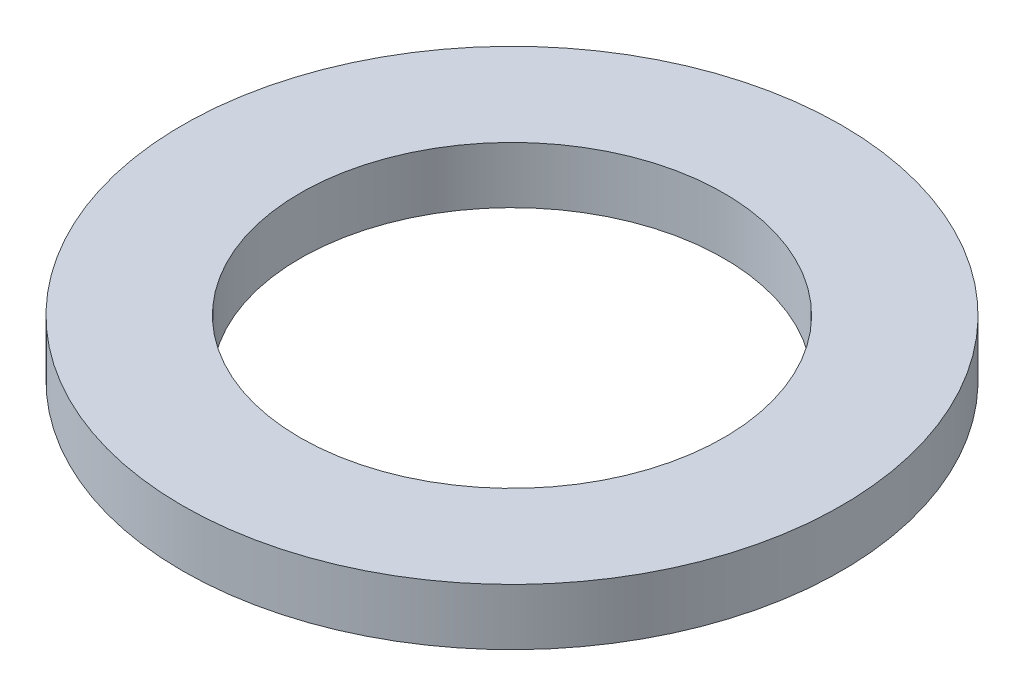
ISO-10303-21;
HEADER;
FILE_DESCRIPTION(('STEP AP214'),'2;1');
FILE_NAME('part.step','',(''),(''),'','','');
FILE_SCHEMA(('AUTOMOTIVE_DESIGN { 1 0 10303 214 1 1 1 1 }'));
ENDSEC;
DATA;
#1=APPLICATION_CONTEXT('core data for automotive mechanical design processes');
#2=APPLICATION_PROTOCOL_DEFINITION('international standard','automotive_design',2000,#1);
#3=PRODUCT_CONTEXT('',#1,'mechanical');
#4=PRODUCT('Part','Part','',(#3));
#5=PRODUCT_RELATED_PRODUCT_CATEGORY('part','',(#4));
#6=PRODUCT_DEFINITION_FORMATION('','',#4);
#7=PRODUCT_DEFINITION_CONTEXT('part definition',#1,'design');
#8=PRODUCT_DEFINITION('design','',#6,#7);
#9=PRODUCT_DEFINITION_SHAPE('','',#8);
#10=(LENGTH_UNIT() NAMED_UNIT(*) SI_UNIT(.MILLI.,.METRE.));
#11=(NAMED_UNIT(*) PLANE_ANGLE_UNIT() SI_UNIT($,.RADIAN.));
#12=(NAMED_UNIT(*) SI_UNIT($,.STERADIAN.) SOLID_ANGLE_UNIT());
#13=UNCERTAINTY_MEASURE_WITH_UNIT(LENGTH_MEASURE(1.E-05),#10,'distance_accuracy_value','');
#14=(GEOMETRIC_REPRESENTATION_CONTEXT(3) GLOBAL_UNCERTAINTY_ASSIGNED_CONTEXT((#13)) GLOBAL_UNIT_ASSIGNED_CONTEXT((#10,
#11,#12)) REPRESENTATION_CONTEXT('',''));
#15=CARTESIAN_POINT('',(0.,0.,0.));
#16=DIRECTION('',(0.,0.,1.));
#17=DIRECTION('',(1.,0.,0.));
#18=AXIS2_PLACEMENT_3D('',#15,#16,#17);
#19=CARTESIAN_POINT('',(0.,3.,0.));
#20=DIRECTION('',(0.,-1.,0.));
#21=DIRECTION('',(0.,0.,-1.));
#22=AXIS2_PLACEMENT_3D('',#19,#20,#21);
#23=CYLINDRICAL_SURFACE('',#22,17.5);
#24=CARTESIAN_POINT('',(0.,3.,0.));
#25=DIRECTION('',(0.,1.,0.));
#26=DIRECTION('',(0.,0.,1.));
#27=AXIS2_PLACEMENT_3D('',#24,#25,#26);
#28=CIRCLE('',#27,17.5);
#29=CARTESIAN_POINT('',(0.,3.,17.5));
#30=VERTEX_POINT('',#29);
#31=EDGE_CURVE('E10',#30,#30,#28,.T.);
#32=ORIENTED_EDGE('',*,*,#31,.F.);
#33=EDGE_LOOP('',(#32));
#34=FACE_BOUND('',#33,.T.);
#35=CARTESIAN_POINT('',(0.,0.,0.));
#36=DIRECTION('',(0.,1.,0.));
#37=DIRECTION('',(0.,0.,1.));
#38=AXIS2_PLACEMENT_3D('',#35,#36,#37);
#39=CIRCLE('',#38,17.5);
#40=CARTESIAN_POINT('',(0.,0.,17.5));
#41=VERTEX_POINT('',#40);
#42=EDGE_CURVE('E34',#41,#41,#39,.T.);
#43=ORIENTED_EDGE('',*,*,#42,.T.);
#44=EDGE_LOOP('',(#43));
#45=FACE_BOUND('',#44,.T.);
#46=ADVANCED_FACE('F31',(#34,#45),#23,.T.);
#47=CARTESIAN_POINT('',(0.,3.,0.));
#48=DIRECTION('',(0.,1.,0.));
#49=DIRECTION('',(0.,0.,1.));
#50=AXIS2_PLACEMENT_3D('',#47,#48,#49);
#51=PLANE('',#50);
#52=CARTESIAN_POINT('',(0.,3.,0.));
#53=DIRECTION('',(0.,1.,0.));
#54=DIRECTION('',(0.,0.,1.));
#55=AXIS2_PLACEMENT_3D('',#52,#53,#54);
#56=CIRCLE('',#55,11.25);
#57=CARTESIAN_POINT('',(0.,3.,11.25));
#58=VERTEX_POINT('',#57);
#59=EDGE_CURVE('E43',#58,#58,#56,.T.);
#60=ORIENTED_EDGE('',*,*,#59,.F.);
#61=EDGE_LOOP('',(#60));
#62=FACE_BOUND('',#61,.T.);
#63=ORIENTED_EDGE('',*,*,#31,.T.);
#64=EDGE_LOOP('',(#63));
#65=FACE_BOUND('',#64,.T.);
#66=ADVANCED_FACE('F58',(#62,#65),#51,.T.);
#67=CARTESIAN_POINT('',(0.,0.,0.));
#68=DIRECTION('',(0.,1.,0.));
#69=DIRECTION('',(0.,0.,1.));
#70=AXIS2_PLACEMENT_3D('',#67,#68,#69);
#71=PLANE('',#70);
#72=CARTESIAN_POINT('',(0.,0.,0.));
#73=DIRECTION('',(0.,1.,0.));
#74=DIRECTION('',(0.,0.,1.));
#75=AXIS2_PLACEMENT_3D('',#72,#73,#74);
#76=CIRCLE('',#75,11.25);
#77=CARTESIAN_POINT('',(0.,0.,11.25));
#78=VERTEX_POINT('',#77);
#79=EDGE_CURVE('E41',#78,#78,#76,.T.);
#80=ORIENTED_EDGE('',*,*,#79,.T.);
#81=EDGE_LOOP('',(#80));
#82=FACE_BOUND('',#81,.T.);
#83=ORIENTED_EDGE('',*,*,#42,.F.);
#84=EDGE_LOOP('',(#83));
#85=FACE_BOUND('',#84,.T.);
#86=ADVANCED_FACE('F49',(#82,#85),#71,.F.);
#87=CARTESIAN_POINT('',(0.,0.,0.));
#88=DIRECTION('',(0.,1.,0.));
#89=DIRECTION('',(0.,0.,1.));
#90=AXIS2_PLACEMENT_3D('',#87,#88,#89);
#91=CYLINDRICAL_SURFACE('',#90,11.25);
#92=ORIENTED_EDGE('',*,*,#79,.F.);
#93=EDGE_LOOP('',(#92));
#94=FACE_BOUND('',#93,.T.);
#95=ORIENTED_EDGE('',*,*,#59,.T.);
#96=EDGE_LOOP('',(#95));
#97=FACE_BOUND('',#96,.T.);
#98=ADVANCED_FACE('F52',(#94,#97),#91,.F.);
#99=CLOSED_SHELL('',(#46,#66,#86,#98));
#100=MANIFOLD_SOLID_BREP('B2',#99);
#101=ADVANCED_BREP_SHAPE_REPRESENTATION('',(#18,#100),#14);
#102=SHAPE_DEFINITION_REPRESENTATION(#9,#101);
ENDSEC;
END-ISO-10303-21;
